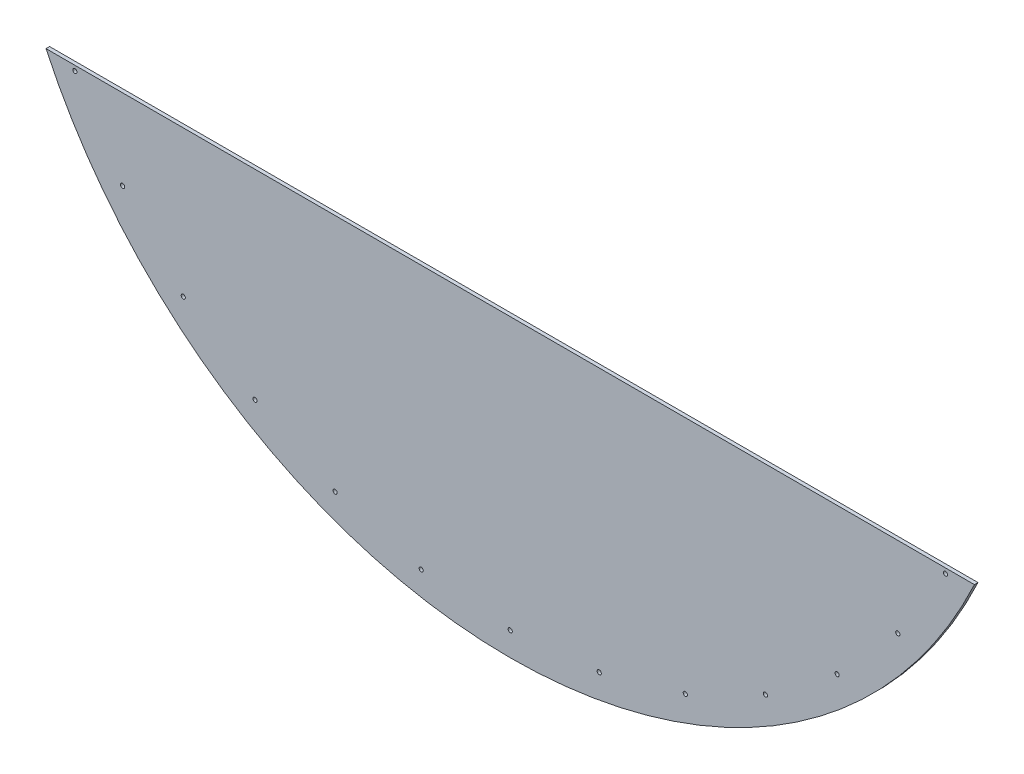
ISO-10303-21;
HEADER;
FILE_DESCRIPTION(('STEP AP214'),'2;1');
FILE_NAME('part.step','',(''),(''),'','','');
FILE_SCHEMA(('AUTOMOTIVE_DESIGN { 1 0 10303 214 1 1 1 1 }'));
ENDSEC;
DATA;
#1=APPLICATION_CONTEXT('core data for automotive mechanical design processes');
#2=APPLICATION_PROTOCOL_DEFINITION('international standard','automotive_design',2000,#1);
#3=PRODUCT_CONTEXT('',#1,'mechanical');
#4=PRODUCT('Part','Part','',(#3));
#5=PRODUCT_RELATED_PRODUCT_CATEGORY('part','',(#4));
#6=PRODUCT_DEFINITION_FORMATION('','',#4);
#7=PRODUCT_DEFINITION_CONTEXT('part definition',#1,'design');
#8=PRODUCT_DEFINITION('design','',#6,#7);
#9=PRODUCT_DEFINITION_SHAPE('','',#8);
#10=(LENGTH_UNIT() NAMED_UNIT(*) SI_UNIT(.MILLI.,.METRE.));
#11=(NAMED_UNIT(*) PLANE_ANGLE_UNIT() SI_UNIT($,.RADIAN.));
#12=(NAMED_UNIT(*) SI_UNIT($,.STERADIAN.) SOLID_ANGLE_UNIT());
#13=UNCERTAINTY_MEASURE_WITH_UNIT(LENGTH_MEASURE(1.E-05),#10,'distance_accuracy_value','');
#14=(GEOMETRIC_REPRESENTATION_CONTEXT(3) GLOBAL_UNCERTAINTY_ASSIGNED_CONTEXT((#13)) GLOBAL_UNIT_ASSIGNED_CONTEXT((#10,
#11,#12)) REPRESENTATION_CONTEXT('',''));
#15=CARTESIAN_POINT('',(0.,0.,0.));
#16=DIRECTION('',(0.,0.,1.));
#17=DIRECTION('',(1.,0.,0.));
#18=AXIS2_PLACEMENT_3D('',#15,#16,#17);
#19=CARTESIAN_POINT('',(-730.625349834463,-372.272209786429,3.99999999999989));
#20=DIRECTION('',(0.,0.,-1.00000000000001));
#21=DIRECTION('',(-0.453990499739545,0.891006524188374,0.));
#22=AXIS2_PLACEMENT_3D('',#19,#20,#21);
#23=CYLINDRICAL_SURFACE('',#22,3.5);
#24=CARTESIAN_POINT('',(-730.625349834463,-372.272209786428,0.));
#25=DIRECTION('',(0.,0.,1.00000000000001));
#26=DIRECTION('',(0.453990499739545,-0.891006524188374,0.));
#27=AXIS2_PLACEMENT_3D('',#24,#25,#26);
#28=CIRCLE('',#27,3.5);
#29=CARTESIAN_POINT('',(-729.036383085375,-375.390732621088,0.));
#30=VERTEX_POINT('',#29);
#31=EDGE_CURVE('E45',#30,#30,#28,.T.);
#32=ORIENTED_EDGE('',*,*,#31,.T.);
#33=EDGE_LOOP('',(#32));
#34=FACE_BOUND('',#33,.T.);
#35=CARTESIAN_POINT('',(-730.625349834463,-372.272209786429,-6.00000000000017));
#36=DIRECTION('',(0.,0.,-1.00000000000001));
#37=DIRECTION('',(-0.453990499739545,0.891006524188374,0.));
#38=AXIS2_PLACEMENT_3D('',#35,#36,#37);
#39=CIRCLE('',#38,3.5);
#40=CARTESIAN_POINT('',(-732.214316583551,-369.153686951769,-6.00000000000017));
#41=VERTEX_POINT('',#40);
#42=EDGE_CURVE('E11',#41,#41,#39,.T.);
#43=ORIENTED_EDGE('',*,*,#42,.T.);
#44=EDGE_LOOP('',(#43));
#45=FACE_BOUND('',#44,.T.);
#46=ADVANCED_FACE('F38',(#34,#45),#23,.F.);
#47=CARTESIAN_POINT('',(-650.549739038813,-499.184371787153,4.00000000000017));
#48=DIRECTION('',(0.,0.,-1.00000000000001));
#49=DIRECTION('',(-0.608761429008719,0.793353340291241,0.));
#50=AXIS2_PLACEMENT_3D('',#47,#48,#49);
#51=CYLINDRICAL_SURFACE('',#50,3.5);
#52=CARTESIAN_POINT('',(-650.549739038813,-499.184371787153,0.));
#53=DIRECTION('',(0.,0.,1.00000000000001));
#54=DIRECTION('',(0.608761429008719,-0.793353340291241,0.));
#55=AXIS2_PLACEMENT_3D('',#52,#53,#54);
#56=CIRCLE('',#55,3.5);
#57=CARTESIAN_POINT('',(-648.419074037282,-501.961108478172,0.));
#58=VERTEX_POINT('',#57);
#59=EDGE_CURVE('E159',#58,#58,#56,.T.);
#60=ORIENTED_EDGE('',*,*,#59,.T.);
#61=EDGE_LOOP('',(#60));
#62=FACE_BOUND('',#61,.T.);
#63=CARTESIAN_POINT('',(-650.549739038813,-499.184371787153,-5.99999999999984));
#64=DIRECTION('',(0.,0.,-1.00000000000001));
#65=DIRECTION('',(-0.608761429008719,0.793353340291241,0.));
#66=AXIS2_PLACEMENT_3D('',#63,#64,#65);
#67=CIRCLE('',#66,3.5);
#68=CARTESIAN_POINT('',(-652.680404040343,-496.407635096133,-5.99999999999984));
#69=VERTEX_POINT('',#68);
#70=EDGE_CURVE('E162',#69,#69,#67,.T.);
#71=ORIENTED_EDGE('',*,*,#70,.T.);
#72=EDGE_LOOP('',(#71));
#73=FACE_BOUND('',#72,.T.);
#74=ADVANCED_FACE('F221',(#62,#73),#51,.F.);
#75=CARTESIAN_POINT('',(-548.687097214265,-609.378756891466,3.99999999999964));
#76=DIRECTION('',(0.,0.,-1.00000000000001));
#77=DIRECTION('',(-0.743144825477393,0.669130606358863,0.));
#78=AXIS2_PLACEMENT_3D('',#75,#76,#77);
#79=CYLINDRICAL_SURFACE('',#78,3.5);
#80=CARTESIAN_POINT('',(-548.687097214265,-609.378756891466,-5.82867087928207E-13));
#81=DIRECTION('',(0.,0.,1.00000000000001));
#82=DIRECTION('',(0.743144825477393,-0.669130606358863,0.));
#83=AXIS2_PLACEMENT_3D('',#80,#81,#82);
#84=CIRCLE('',#83,3.5);
#85=CARTESIAN_POINT('',(-546.086090325094,-611.720714013722,-5.82672798898898E-13));
#86=VERTEX_POINT('',#85);
#87=EDGE_CURVE('E153',#86,#86,#84,.T.);
#88=ORIENTED_EDGE('',*,*,#87,.T.);
#89=EDGE_LOOP('',(#88));
#90=FACE_BOUND('',#89,.T.);
#91=CARTESIAN_POINT('',(-548.687097214265,-609.378756891466,-6.00000000000062));
#92=DIRECTION('',(0.,0.,-1.00000000000001));
#93=DIRECTION('',(-0.743144825477393,0.669130606358863,0.));
#94=AXIS2_PLACEMENT_3D('',#91,#92,#93);
#95=CIRCLE('',#94,3.5);
#96=CARTESIAN_POINT('',(-551.288104103435,-607.03679976921,-6.00000000000062));
#97=VERTEX_POINT('',#96);
#98=EDGE_CURVE('E156',#97,#97,#95,.T.);
#99=ORIENTED_EDGE('',*,*,#98,.T.);
#100=EDGE_LOOP('',(#99));
#101=FACE_BOUND('',#100,.T.);
#102=ADVANCED_FACE('F225',(#90,#101),#79,.F.);
#103=CARTESIAN_POINT('',(-428.448823067079,-699.164934770359,3.99999999999989));
#104=DIRECTION('',(0.,0.,-1.00000000000001));
#105=DIRECTION('',(-0.852640164354092,0.522498564715953,0.));
#106=AXIS2_PLACEMENT_3D('',#103,#104,#105);
#107=CYLINDRICAL_SURFACE('',#106,3.5);
#108=CARTESIAN_POINT('',(-428.448823067079,-699.164934770359,0.));
#109=DIRECTION('',(0.,0.,1.00000000000001));
#110=DIRECTION('',(0.852640164354092,-0.522498564715953,0.));
#111=AXIS2_PLACEMENT_3D('',#108,#109,#110);
#112=CIRCLE('',#111,3.5);
#113=CARTESIAN_POINT('',(-425.464582491839,-700.993679746865,0.));
#114=VERTEX_POINT('',#113);
#115=EDGE_CURVE('E147',#114,#114,#112,.T.);
#116=ORIENTED_EDGE('',*,*,#115,.T.);
#117=EDGE_LOOP('',(#116));
#118=FACE_BOUND('',#117,.T.);
#119=CARTESIAN_POINT('',(-428.448823067079,-699.164934770359,-5.99999999999995));
#120=DIRECTION('',(0.,0.,-1.00000000000001));
#121=DIRECTION('',(-0.852640164354092,0.522498564715953,0.));
#122=AXIS2_PLACEMENT_3D('',#119,#120,#121);
#123=CIRCLE('',#122,3.5);
#124=CARTESIAN_POINT('',(-431.433063642318,-697.336189793853,-5.99999999999995));
#125=VERTEX_POINT('',#124);
#126=EDGE_CURVE('E150',#125,#125,#123,.T.);
#127=ORIENTED_EDGE('',*,*,#126,.T.);
#128=EDGE_LOOP('',(#127));
#129=FACE_BOUND('',#128,.T.);
#130=ADVANCED_FACE('F230',(#118,#129),#107,.F.);
#131=CARTESIAN_POINT('',(-293.861718627147,-765.535949727709,4.00000000000011));
#132=DIRECTION('',(0.,0.,-1.00000000000001));
#133=DIRECTION('',(-0.933580426497201,0.358367949545303,0.));
#134=AXIS2_PLACEMENT_3D('',#131,#132,#133);
#135=CYLINDRICAL_SURFACE('',#134,3.5);
#136=CARTESIAN_POINT('',(-293.861718627147,-765.535949727709,0.));
#137=DIRECTION('',(0.,0.,1.00000000000001));
#138=DIRECTION('',(0.933580426497201,-0.358367949545303,0.));
#139=AXIS2_PLACEMENT_3D('',#136,#137,#138);
#140=CIRCLE('',#139,3.5);
#141=CARTESIAN_POINT('',(-290.594187134406,-766.790237551117,0.));
#142=VERTEX_POINT('',#141);
#143=EDGE_CURVE('E141',#142,#142,#140,.T.);
#144=ORIENTED_EDGE('',*,*,#143,.T.);
#145=EDGE_LOOP('',(#144));
#146=FACE_BOUND('',#145,.T.);
#147=CARTESIAN_POINT('',(-293.861718627147,-765.535949727709,-6.00000000000017));
#148=DIRECTION('',(0.,0.,-1.00000000000001));
#149=DIRECTION('',(-0.933580426497201,0.358367949545303,0.));
#150=AXIS2_PLACEMENT_3D('',#147,#148,#149);
#151=CIRCLE('',#150,3.5);
#152=CARTESIAN_POINT('',(-297.129250119887,-764.2816619043,-6.00000000000017));
#153=VERTEX_POINT('',#152);
#154=EDGE_CURVE('E144',#153,#153,#151,.T.);
#155=ORIENTED_EDGE('',*,*,#154,.T.);
#156=EDGE_LOOP('',(#155));
#157=FACE_BOUND('',#156,.T.);
#158=ADVANCED_FACE('F237',(#146,#157),#135,.F.);
#159=CARTESIAN_POINT('',(-149.433130903561,-806.269024202447,3.99999999999989));
#160=DIRECTION('',(0.,0.,-1.00000000000001));
#161=DIRECTION('',(-0.983254907563954,0.182235525492149,0.));
#162=AXIS2_PLACEMENT_3D('',#159,#160,#161);
#163=CYLINDRICAL_SURFACE('',#162,3.5);
#164=CARTESIAN_POINT('',(-149.433130903561,-806.269024202447,-4.16333634234434E-13));
#165=DIRECTION('',(0.,0.,1.00000000000001));
#166=DIRECTION('',(0.983254907563954,-0.182235525492149,0.));
#167=AXIS2_PLACEMENT_3D('',#164,#165,#166);
#168=CIRCLE('',#167,3.5);
#169=CARTESIAN_POINT('',(-145.991738727087,-806.90684854167,-4.16333634234434E-13));
#170=VERTEX_POINT('',#169);
#171=EDGE_CURVE('E135',#170,#170,#168,.T.);
#172=ORIENTED_EDGE('',*,*,#171,.T.);
#173=EDGE_LOOP('',(#172));
#174=FACE_BOUND('',#173,.T.);
#175=CARTESIAN_POINT('',(-149.433130903561,-806.269024202447,-6.00000000000062));
#176=DIRECTION('',(0.,0.,-1.00000000000001));
#177=DIRECTION('',(-0.983254907563954,0.182235525492149,0.));
#178=AXIS2_PLACEMENT_3D('',#175,#176,#177);
#179=CIRCLE('',#178,3.5);
#180=CARTESIAN_POINT('',(-152.874523080035,-805.631199863225,-6.00000000000062));
#181=VERTEX_POINT('',#180);
#182=EDGE_CURVE('E138',#181,#181,#179,.T.);
#183=ORIENTED_EDGE('',*,*,#182,.T.);
#184=EDGE_LOOP('',(#183));
#185=FACE_BOUND('',#184,.T.);
#186=ADVANCED_FACE('F241',(#174,#185),#163,.F.);
#187=CARTESIAN_POINT('',(730.625349834462,-372.272209786428,3.99999999999998));
#188=DIRECTION('',(0.,0.,-1.00000000000001));
#189=DIRECTION('',(-0.453990499739545,-0.891006524188374,0.));
#190=AXIS2_PLACEMENT_3D('',#187,#188,#189);
#191=CYLINDRICAL_SURFACE('',#190,3.5);
#192=CARTESIAN_POINT('',(730.625349834462,-372.272209786428,-1.94289029309402E-13));
#193=DIRECTION('',(0.,0.,1.00000000000001));
#194=DIRECTION('',(0.453990499739545,0.891006524188374,0.));
#195=AXIS2_PLACEMENT_3D('',#192,#193,#194);
#196=CIRCLE('',#195,3.5);
#197=CARTESIAN_POINT('',(732.21431658355,-369.153686951769,-1.93511873192165E-13));
#198=VERTEX_POINT('',#197);
#199=EDGE_CURVE('E129',#198,#198,#196,.T.);
#200=ORIENTED_EDGE('',*,*,#199,.T.);
#201=EDGE_LOOP('',(#200));
#202=FACE_BOUND('',#201,.T.);
#203=CARTESIAN_POINT('',(730.625349834462,-372.272209786429,-6.00000000000017));
#204=DIRECTION('',(0.,0.,-1.00000000000001));
#205=DIRECTION('',(-0.453990499739545,-0.891006524188374,0.));
#206=AXIS2_PLACEMENT_3D('',#203,#204,#205);
#207=CIRCLE('',#206,3.5);
#208=CARTESIAN_POINT('',(729.036383085374,-375.390732621088,-6.00000000000017));
#209=VERTEX_POINT('',#208);
#210=EDGE_CURVE('E132',#209,#209,#207,.T.);
#211=ORIENTED_EDGE('',*,*,#210,.T.);
#212=EDGE_LOOP('',(#211));
#213=FACE_BOUND('',#212,.T.);
#214=ADVANCED_FACE('F245',(#202,#213),#191,.F.);
#215=CARTESIAN_POINT('',(650.549739038815,-499.184371787152,3.99999999999961));
#216=DIRECTION('',(0.,0.,-1.00000000000001));
#217=DIRECTION('',(-0.608761429008719,-0.793353340291241,0.));
#218=AXIS2_PLACEMENT_3D('',#215,#216,#217);
#219=CYLINDRICAL_SURFACE('',#218,3.5);
#220=CARTESIAN_POINT('',(650.549739038815,-499.184371787152,-1.11022302462516E-13));
#221=DIRECTION('',(0.,0.,1.00000000000001));
#222=DIRECTION('',(0.608761429008719,0.793353340291241,0.));
#223=AXIS2_PLACEMENT_3D('',#220,#221,#222);
#224=CIRCLE('',#223,3.5);
#225=CARTESIAN_POINT('',(652.680404040345,-496.407635096133,-1.0966227925735E-13));
#226=VERTEX_POINT('',#225);
#227=EDGE_CURVE('E123',#226,#226,#224,.T.);
#228=ORIENTED_EDGE('',*,*,#227,.T.);
#229=EDGE_LOOP('',(#228));
#230=FACE_BOUND('',#229,.T.);
#231=CARTESIAN_POINT('',(650.549739038815,-499.184371787152,-6.00000000000017));
#232=DIRECTION('',(0.,0.,-1.00000000000001));
#233=DIRECTION('',(-0.608761429008719,-0.793353340291241,0.));
#234=AXIS2_PLACEMENT_3D('',#231,#232,#233);
#235=CIRCLE('',#234,3.5);
#236=CARTESIAN_POINT('',(648.419074037284,-501.961108478171,-6.00000000000017));
#237=VERTEX_POINT('',#236);
#238=EDGE_CURVE('E126',#237,#237,#235,.T.);
#239=ORIENTED_EDGE('',*,*,#238,.T.);
#240=EDGE_LOOP('',(#239));
#241=FACE_BOUND('',#240,.T.);
#242=ADVANCED_FACE('F249',(#230,#241),#219,.F.);
#243=CARTESIAN_POINT('',(548.687097214265,-609.378756891466,4.00000000000034));
#244=DIRECTION('',(0.,0.,-1.00000000000001));
#245=DIRECTION('',(-0.743144825477393,-0.669130606358863,0.));
#246=AXIS2_PLACEMENT_3D('',#243,#244,#245);
#247=CYLINDRICAL_SURFACE('',#246,3.5);
#248=CARTESIAN_POINT('',(548.687097214265,-609.378756891466,1.38777878078145E-13));
#249=DIRECTION('',(0.,0.,1.00000000000001));
#250=DIRECTION('',(0.743144825477393,0.669130606358863,0.));
#251=AXIS2_PLACEMENT_3D('',#248,#249,#250);
#252=CIRCLE('',#251,3.5);
#253=CARTESIAN_POINT('',(551.288104103436,-607.03679976921,1.39360745166073E-13));
#254=VERTEX_POINT('',#253);
#255=EDGE_CURVE('E117',#254,#254,#252,.T.);
#256=ORIENTED_EDGE('',*,*,#255,.T.);
#257=EDGE_LOOP('',(#256));
#258=FACE_BOUND('',#257,.T.);
#259=CARTESIAN_POINT('',(548.687097214265,-609.378756891465,-5.99999999999984));
#260=DIRECTION('',(0.,0.,-1.00000000000001));
#261=DIRECTION('',(-0.743144825477393,-0.669130606358863,0.));
#262=AXIS2_PLACEMENT_3D('',#259,#260,#261);
#263=CIRCLE('',#262,3.5);
#264=CARTESIAN_POINT('',(546.086090325094,-611.720714013721,-5.99999999999984));
#265=VERTEX_POINT('',#264);
#266=EDGE_CURVE('E120',#265,#265,#263,.T.);
#267=ORIENTED_EDGE('',*,*,#266,.T.);
#268=EDGE_LOOP('',(#267));
#269=FACE_BOUND('',#268,.T.);
#270=ADVANCED_FACE('F253',(#258,#269),#247,.F.);
#271=CARTESIAN_POINT('',(428.448823067079,-699.164934770359,4.00000000000017));
#272=DIRECTION('',(0.,0.,-1.00000000000001));
#273=DIRECTION('',(-0.852640164354092,-0.522498564715953,0.));
#274=AXIS2_PLACEMENT_3D('',#271,#272,#273);
#275=CYLINDRICAL_SURFACE('',#274,3.5);
#276=CARTESIAN_POINT('',(428.448823067079,-699.164934770358,-2.22044604925031E-13));
#277=DIRECTION('',(0.,0.,1.00000000000001));
#278=DIRECTION('',(0.852640164354092,0.522498564715953,0.));
#279=AXIS2_PLACEMENT_3D('',#276,#277,#278);
#280=CIRCLE('',#279,3.5);
#281=CARTESIAN_POINT('',(431.433063642318,-697.336189793852,-2.22044604925031E-13));
#282=VERTEX_POINT('',#281);
#283=EDGE_CURVE('E111',#282,#282,#280,.T.);
#284=ORIENTED_EDGE('',*,*,#283,.T.);
#285=EDGE_LOOP('',(#284));
#286=FACE_BOUND('',#285,.T.);
#287=CARTESIAN_POINT('',(428.448823067079,-699.164934770358,-6.00000000000039));
#288=DIRECTION('',(0.,0.,-1.00000000000001));
#289=DIRECTION('',(-0.852640164354092,-0.522498564715953,0.));
#290=AXIS2_PLACEMENT_3D('',#287,#288,#289);
#291=CIRCLE('',#290,3.5);
#292=CARTESIAN_POINT('',(425.46458249184,-700.993679746864,-6.00000000000039));
#293=VERTEX_POINT('',#292);
#294=EDGE_CURVE('E114',#293,#293,#291,.T.);
#295=ORIENTED_EDGE('',*,*,#294,.T.);
#296=EDGE_LOOP('',(#295));
#297=FACE_BOUND('',#296,.T.);
#298=ADVANCED_FACE('F257',(#286,#297),#275,.F.);
#299=CARTESIAN_POINT('',(293.861718627147,-765.53594972771,3.99999999999992));
#300=DIRECTION('',(0.,0.,-1.00000000000001));
#301=DIRECTION('',(-0.933580426497202,-0.358367949545303,0.));
#302=AXIS2_PLACEMENT_3D('',#299,#300,#301);
#303=CYLINDRICAL_SURFACE('',#302,3.5);
#304=CARTESIAN_POINT('',(293.861718627147,-765.535949727709,0.));
#305=DIRECTION('',(0.,0.,1.00000000000001));
#306=DIRECTION('',(0.933580426497202,0.358367949545303,0.));
#307=AXIS2_PLACEMENT_3D('',#304,#305,#306);
#308=CIRCLE('',#307,3.5);
#309=CARTESIAN_POINT('',(297.129250119887,-764.281661904301,0.));
#310=VERTEX_POINT('',#309);
#311=EDGE_CURVE('E105',#310,#310,#308,.T.);
#312=ORIENTED_EDGE('',*,*,#311,.T.);
#313=EDGE_LOOP('',(#312));
#314=FACE_BOUND('',#313,.T.);
#315=CARTESIAN_POINT('',(293.861718627147,-765.53594972771,-6.00000000000006));
#316=DIRECTION('',(0.,0.,-1.00000000000001));
#317=DIRECTION('',(-0.933580426497202,-0.358367949545303,0.));
#318=AXIS2_PLACEMENT_3D('',#315,#316,#317);
#319=CIRCLE('',#318,3.5);
#320=CARTESIAN_POINT('',(290.594187134407,-766.790237551118,-6.00000000000006));
#321=VERTEX_POINT('',#320);
#322=EDGE_CURVE('E108',#321,#321,#319,.T.);
#323=ORIENTED_EDGE('',*,*,#322,.T.);
#324=EDGE_LOOP('',(#323));
#325=FACE_BOUND('',#324,.T.);
#326=ADVANCED_FACE('F199',(#314,#325),#303,.F.);
#327=CARTESIAN_POINT('',(149.433130903561,-806.269024202447,4.00000000000081));
#328=DIRECTION('',(0.,0.,-1.00000000000001));
#329=DIRECTION('',(-0.983254907563955,-0.182235525492149,0.));
#330=AXIS2_PLACEMENT_3D('',#327,#328,#329);
#331=CYLINDRICAL_SURFACE('',#330,3.5);
#332=CARTESIAN_POINT('',(149.433130903561,-806.269024202447,5.82867087928207E-13));
#333=DIRECTION('',(0.,0.,1.00000000000001));
#334=DIRECTION('',(0.983254907563955,0.182235525492149,0.));
#335=AXIS2_PLACEMENT_3D('',#332,#333,#334);
#336=CIRCLE('',#335,3.5);
#337=CARTESIAN_POINT('',(152.874523080035,-805.631199863224,5.8281851567088E-13));
#338=VERTEX_POINT('',#337);
#339=EDGE_CURVE('E79',#338,#338,#336,.T.);
#340=ORIENTED_EDGE('',*,*,#339,.T.);
#341=EDGE_LOOP('',(#340));
#342=FACE_BOUND('',#341,.T.);
#343=CARTESIAN_POINT('',(149.433130903561,-806.269024202447,-5.99999999999928));
#344=DIRECTION('',(0.,0.,-1.00000000000001));
#345=DIRECTION('',(-0.983254907563955,-0.182235525492149,0.));
#346=AXIS2_PLACEMENT_3D('',#343,#344,#345);
#347=CIRCLE('',#346,3.5);
#348=CARTESIAN_POINT('',(145.991738727088,-806.906848541669,-5.99999999999928));
#349=VERTEX_POINT('',#348);
#350=EDGE_CURVE('E102',#349,#349,#347,.T.);
#351=ORIENTED_EDGE('',*,*,#350,.T.);
#352=EDGE_LOOP('',(#351));
#353=FACE_BOUND('',#352,.T.);
#354=ADVANCED_FACE('F196',(#342,#353),#331,.F.);
#355=CARTESIAN_POINT('',(0.,1.11022302462516E-13,-6.00000000000017));
#356=DIRECTION('',(0.,0.,1.00000000000001));
#357=DIRECTION('',(1.,0.,0.));
#358=AXIS2_PLACEMENT_3D('',#355,#356,#357);
#359=CYLINDRICAL_SURFACE('',#358,860.);
#360=CARTESIAN_POINT('',(0.,1.11022302462516E-13,-6.00000000000017));
#361=DIRECTION('',(0.,0.,1.00000000000001));
#362=DIRECTION('',(1.,0.,0.));
#363=AXIS2_PLACEMENT_3D('',#360,#361,#362);
#364=CIRCLE('',#363,860.);
#365=CARTESIAN_POINT('',(-779.168787875901,-364.000000000002,-6.00000000000006));
#366=VERTEX_POINT('',#365);
#367=CARTESIAN_POINT('',(779.1687878759,-364.000000000002,-5.99999999999984));
#368=VERTEX_POINT('',#367);
#369=EDGE_CURVE('E75',#366,#368,#364,.T.);
#370=ORIENTED_EDGE('',*,*,#369,.T.);
#371=DIRECTION('',(0.,0.,1.00000000000001));
#372=VECTOR('',#371,1.);
#373=CARTESIAN_POINT('',(779.1687878759,-364.000000000002,3.33066907387547E-13));
#374=LINE('',#373,#372);
#375=CARTESIAN_POINT('',(779.1687878759,-364.000000000002,3.33066907387547E-13));
#376=VERTEX_POINT('',#375);
#377=EDGE_CURVE('E58',#376,#368,#374,.F.);
#378=ORIENTED_EDGE('',*,*,#377,.F.);
#379=CARTESIAN_POINT('',(0.,0.,0.));
#380=DIRECTION('',(0.,0.,1.00000000000001));
#381=DIRECTION('',(1.,0.,0.));
#382=AXIS2_PLACEMENT_3D('',#379,#380,#381);
#383=CIRCLE('',#382,860.);
#384=CARTESIAN_POINT('',(-779.168787875901,-364.000000000002,-1.66533453693773E-13));
#385=VERTEX_POINT('',#384);
#386=EDGE_CURVE('E73',#385,#376,#383,.T.);
#387=ORIENTED_EDGE('',*,*,#386,.F.);
#388=DIRECTION('',(0.,0.,1.00000000000001));
#389=VECTOR('',#388,1.);
#390=CARTESIAN_POINT('',(-779.168787875901,-364.000000000002,0.));
#391=LINE('',#390,#389);
#392=EDGE_CURVE('E52',#385,#366,#391,.F.);
#393=ORIENTED_EDGE('',*,*,#392,.T.);
#394=EDGE_LOOP('',(#370,#378,#387,#393));
#395=FACE_BOUND('',#394,.T.);
#396=ADVANCED_FACE('F72',(#395),#359,.T.);
#397=CARTESIAN_POINT('',(0.,1.11022302462516E-13,-6.00000000000017));
#398=DIRECTION('',(0.,0.,1.00000000000001));
#399=DIRECTION('',(1.,0.,0.));
#400=AXIS2_PLACEMENT_3D('',#397,#398,#399);
#401=PLANE('',#400);
#402=ORIENTED_EDGE('',*,*,#42,.F.);
#403=EDGE_LOOP('',(#402));
#404=FACE_BOUND('',#403,.T.);
#405=ORIENTED_EDGE('',*,*,#70,.F.);
#406=EDGE_LOOP('',(#405));
#407=FACE_BOUND('',#406,.T.);
#408=ORIENTED_EDGE('',*,*,#98,.F.);
#409=EDGE_LOOP('',(#408));
#410=FACE_BOUND('',#409,.T.);
#411=ORIENTED_EDGE('',*,*,#126,.F.);
#412=EDGE_LOOP('',(#411));
#413=FACE_BOUND('',#412,.T.);
#414=ORIENTED_EDGE('',*,*,#154,.F.);
#415=EDGE_LOOP('',(#414));
#416=FACE_BOUND('',#415,.T.);
#417=ORIENTED_EDGE('',*,*,#182,.F.);
#418=EDGE_LOOP('',(#417));
#419=FACE_BOUND('',#418,.T.);
#420=ORIENTED_EDGE('',*,*,#210,.F.);
#421=EDGE_LOOP('',(#420));
#422=FACE_BOUND('',#421,.T.);
#423=ORIENTED_EDGE('',*,*,#238,.F.);
#424=EDGE_LOOP('',(#423));
#425=FACE_BOUND('',#424,.T.);
#426=ORIENTED_EDGE('',*,*,#266,.F.);
#427=EDGE_LOOP('',(#426));
#428=FACE_BOUND('',#427,.T.);
#429=ORIENTED_EDGE('',*,*,#294,.F.);
#430=EDGE_LOOP('',(#429));
#431=FACE_BOUND('',#430,.T.);
#432=ORIENTED_EDGE('',*,*,#322,.F.);
#433=EDGE_LOOP('',(#432));
#434=FACE_BOUND('',#433,.T.);
#435=ORIENTED_EDGE('',*,*,#350,.F.);
#436=EDGE_LOOP('',(#435));
#437=FACE_BOUND('',#436,.T.);
#438=CARTESIAN_POINT('',(1.52655665885959E-13,-820.000000000005,-6.00000000000017));
#439=DIRECTION('',(0.,0.,-1.00000000000001));
#440=DIRECTION('',(-1.,0.,0.));
#441=AXIS2_PLACEMENT_3D('',#438,#439,#440);
#442=CIRCLE('',#441,3.5);
#443=CARTESIAN_POINT('',(-3.49999999999985,-820.000000000005,-6.00000000000017));
#444=VERTEX_POINT('',#443);
#445=EDGE_CURVE('E88',#444,#444,#442,.T.);
#446=ORIENTED_EDGE('',*,*,#445,.F.);
#447=EDGE_LOOP('',(#446));
#448=FACE_BOUND('',#447,.T.);
#449=DIRECTION('',(1.,0.,0.));
#450=VECTOR('',#449,1.);
#451=CARTESIAN_POINT('',(0.,-364.000000000002,-6.00000000000006));
#452=LINE('',#451,#450);
#453=EDGE_CURVE('E67',#366,#368,#452,.T.);
#454=ORIENTED_EDGE('',*,*,#453,.T.);
#455=ORIENTED_EDGE('',*,*,#369,.F.);
#456=EDGE_LOOP('',(#454,#455));
#457=FACE_BOUND('',#456,.T.);
#458=ADVANCED_FACE('F171',(#404,#407,#410,#413,#416,#419,#422,#425,#428,#431,#434,#437,#448,
#457),#401,.F.);
#459=CARTESIAN_POINT('',(0.,0.,0.));
#460=DIRECTION('',(0.,0.,1.00000000000001));
#461=DIRECTION('',(1.,0.,0.));
#462=AXIS2_PLACEMENT_3D('',#459,#460,#461);
#463=PLANE('',#462);
#464=ORIENTED_EDGE('',*,*,#31,.F.);
#465=EDGE_LOOP('',(#464));
#466=FACE_BOUND('',#465,.T.);
#467=ORIENTED_EDGE('',*,*,#59,.F.);
#468=EDGE_LOOP('',(#467));
#469=FACE_BOUND('',#468,.T.);
#470=ORIENTED_EDGE('',*,*,#87,.F.);
#471=EDGE_LOOP('',(#470));
#472=FACE_BOUND('',#471,.T.);
#473=ORIENTED_EDGE('',*,*,#115,.F.);
#474=EDGE_LOOP('',(#473));
#475=FACE_BOUND('',#474,.T.);
#476=ORIENTED_EDGE('',*,*,#143,.F.);
#477=EDGE_LOOP('',(#476));
#478=FACE_BOUND('',#477,.T.);
#479=ORIENTED_EDGE('',*,*,#171,.F.);
#480=EDGE_LOOP('',(#479));
#481=FACE_BOUND('',#480,.T.);
#482=ORIENTED_EDGE('',*,*,#199,.F.);
#483=EDGE_LOOP('',(#482));
#484=FACE_BOUND('',#483,.T.);
#485=ORIENTED_EDGE('',*,*,#227,.F.);
#486=EDGE_LOOP('',(#485));
#487=FACE_BOUND('',#486,.T.);
#488=ORIENTED_EDGE('',*,*,#255,.F.);
#489=EDGE_LOOP('',(#488));
#490=FACE_BOUND('',#489,.T.);
#491=ORIENTED_EDGE('',*,*,#283,.F.);
#492=EDGE_LOOP('',(#491));
#493=FACE_BOUND('',#492,.T.);
#494=ORIENTED_EDGE('',*,*,#311,.F.);
#495=EDGE_LOOP('',(#494));
#496=FACE_BOUND('',#495,.T.);
#497=ORIENTED_EDGE('',*,*,#339,.F.);
#498=EDGE_LOOP('',(#497));
#499=FACE_BOUND('',#498,.T.);
#500=CARTESIAN_POINT('',(1.6306400674182E-13,-820.000000000004,-4.16333634234434E-13));
#501=DIRECTION('',(0.,0.,1.00000000000001));
#502=DIRECTION('',(1.,0.,0.));
#503=AXIS2_PLACEMENT_3D('',#500,#501,#502);
#504=CIRCLE('',#503,3.5);
#505=CARTESIAN_POINT('',(3.50000000000017,-820.000000000004,-4.16333634234434E-13));
#506=VERTEX_POINT('',#505);
#507=EDGE_CURVE('E68',#506,#506,#504,.T.);
#508=ORIENTED_EDGE('',*,*,#507,.F.);
#509=EDGE_LOOP('',(#508));
#510=FACE_BOUND('',#509,.T.);
#511=ORIENTED_EDGE('',*,*,#386,.T.);
#512=DIRECTION('',(1.,0.,0.));
#513=VECTOR('',#512,1.);
#514=CARTESIAN_POINT('',(0.,-364.000000000002,0.));
#515=LINE('',#514,#513);
#516=EDGE_CURVE('E62',#385,#376,#515,.T.);
#517=ORIENTED_EDGE('',*,*,#516,.F.);
#518=EDGE_LOOP('',(#511,#517));
#519=FACE_BOUND('',#518,.T.);
#520=ADVANCED_FACE('F77',(#466,#469,#472,#475,#478,#481,#484,#487,#490,#493,#496,#499,#510,
#519),#463,.T.);
#521=CARTESIAN_POINT('',(0.,-364.000000000002,0.));
#522=DIRECTION('',(0.,-1.00000000000001,0.));
#523=DIRECTION('',(1.,0.,0.));
#524=AXIS2_PLACEMENT_3D('',#521,#522,#523);
#525=PLANE('',#524);
#526=ORIENTED_EDGE('',*,*,#516,.T.);
#527=ORIENTED_EDGE('',*,*,#377,.T.);
#528=ORIENTED_EDGE('',*,*,#453,.F.);
#529=ORIENTED_EDGE('',*,*,#392,.F.);
#530=EDGE_LOOP('',(#526,#527,#528,#529));
#531=FACE_BOUND('',#530,.T.);
#532=ADVANCED_FACE('F63',(#531),#525,.F.);
#533=CARTESIAN_POINT('',(1.6306400674182E-13,-820.000000000004,4.00000000000009));
#534=DIRECTION('',(0.,0.,-1.00000000000001));
#535=DIRECTION('',(-1.,0.,0.));
#536=AXIS2_PLACEMENT_3D('',#533,#534,#535);
#537=CYLINDRICAL_SURFACE('',#536,3.5);
#538=ORIENTED_EDGE('',*,*,#507,.T.);
#539=EDGE_LOOP('',(#538));
#540=FACE_BOUND('',#539,.T.);
#541=ORIENTED_EDGE('',*,*,#445,.T.);
#542=EDGE_LOOP('',(#541));
#543=FACE_BOUND('',#542,.T.);
#544=ADVANCED_FACE('F295',(#540,#543),#537,.F.);
#545=CLOSED_SHELL('',(#46,#74,#102,#130,#158,#186,#214,#242,#270,#298,#326,#354,#396,#458,#520,
#532,#544));
#546=MANIFOLD_SOLID_BREP('B2',#545);
#547=ADVANCED_BREP_SHAPE_REPRESENTATION('',(#18,#546),#14);
#548=SHAPE_DEFINITION_REPRESENTATION(#9,#547);
ENDSEC;
END-ISO-10303-21;
